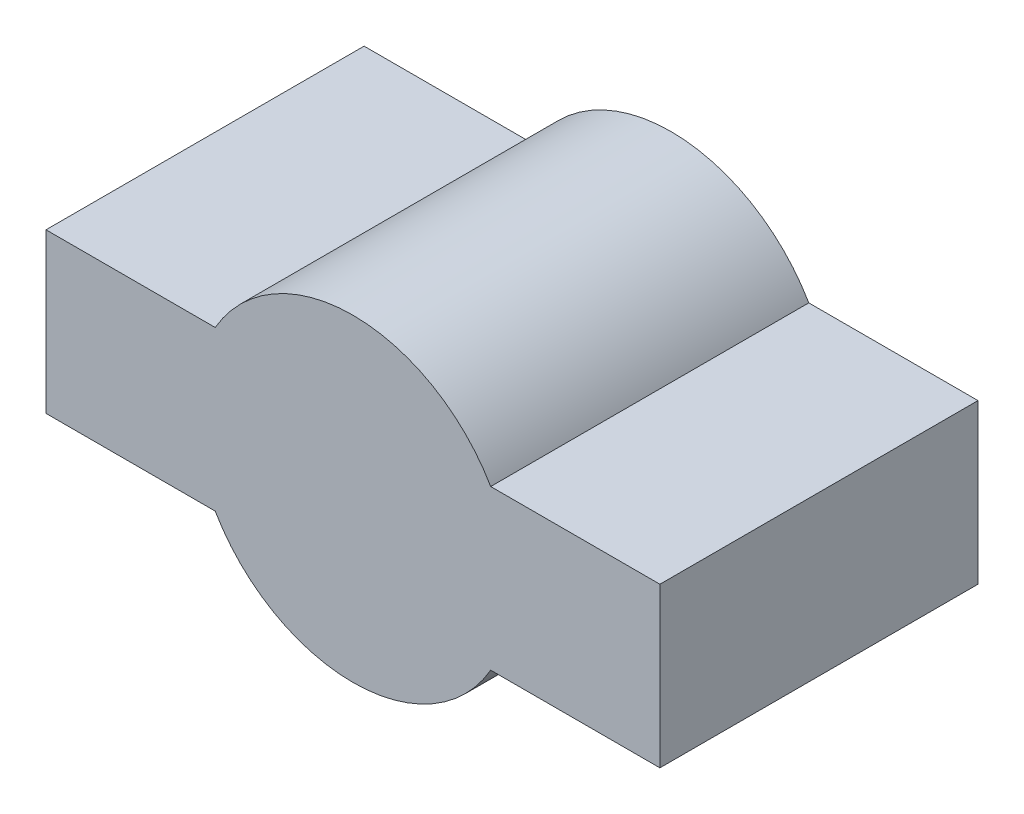
ISO-10303-21;
HEADER;
FILE_DESCRIPTION(('STEP AP214'),'2;1');
FILE_NAME('part.step','',(''),(''),'','','');
FILE_SCHEMA(('AUTOMOTIVE_DESIGN { 1 0 10303 214 1 1 1 1 }'));
ENDSEC;
DATA;
#1=APPLICATION_CONTEXT('core data for automotive mechanical design processes');
#2=APPLICATION_PROTOCOL_DEFINITION('international standard','automotive_design',2000,#1);
#3=PRODUCT_CONTEXT('',#1,'mechanical');
#4=PRODUCT('Part','Part','',(#3));
#5=PRODUCT_RELATED_PRODUCT_CATEGORY('part','',(#4));
#6=PRODUCT_DEFINITION_FORMATION('','',#4);
#7=PRODUCT_DEFINITION_CONTEXT('part definition',#1,'design');
#8=PRODUCT_DEFINITION('design','',#6,#7);
#9=PRODUCT_DEFINITION_SHAPE('','',#8);
#10=(LENGTH_UNIT() NAMED_UNIT(*) SI_UNIT(.MILLI.,.METRE.));
#11=(NAMED_UNIT(*) PLANE_ANGLE_UNIT() SI_UNIT($,.RADIAN.));
#12=(NAMED_UNIT(*) SI_UNIT($,.STERADIAN.) SOLID_ANGLE_UNIT());
#13=UNCERTAINTY_MEASURE_WITH_UNIT(LENGTH_MEASURE(1.E-05),#10,'distance_accuracy_value','');
#14=(GEOMETRIC_REPRESENTATION_CONTEXT(3) GLOBAL_UNCERTAINTY_ASSIGNED_CONTEXT((#13)) GLOBAL_UNIT_ASSIGNED_CONTEXT((#10,
#11,#12)) REPRESENTATION_CONTEXT('',''));
#15=CARTESIAN_POINT('',(0.,0.,0.));
#16=DIRECTION('',(0.,0.,1.));
#17=DIRECTION('',(1.,0.,0.));
#18=AXIS2_PLACEMENT_3D('',#15,#16,#17);
#19=CARTESIAN_POINT('',(0.866025403784439,-0.5,2.));
#20=DIRECTION('',(0.,1.,0.));
#21=DIRECTION('',(0.,0.,1.));
#22=AXIS2_PLACEMENT_3D('',#19,#20,#21);
#23=PLANE('',#22);
#24=DIRECTION('',(1.,0.,0.));
#25=VECTOR('',#24,1.);
#26=CARTESIAN_POINT('',(0.866025403784439,-0.5,0.));
#27=LINE('',#26,#25);
#28=CARTESIAN_POINT('',(0.866025403784438,-0.5,0.));
#29=VERTEX_POINT('',#28);
#30=CARTESIAN_POINT('',(1.93,-0.5,0.));
#31=VERTEX_POINT('',#30);
#32=EDGE_CURVE('E132',#29,#31,#27,.T.);
#33=ORIENTED_EDGE('',*,*,#32,.T.);
#34=DIRECTION('',(0.,0.,-1.));
#35=VECTOR('',#34,1.);
#36=CARTESIAN_POINT('',(1.93,-0.5,2.));
#37=LINE('',#36,#35);
#38=CARTESIAN_POINT('',(1.93,-0.5,2.));
#39=VERTEX_POINT('',#38);
#40=EDGE_CURVE('E11',#39,#31,#37,.T.);
#41=ORIENTED_EDGE('',*,*,#40,.F.);
#42=DIRECTION('',(1.,0.,0.));
#43=VECTOR('',#42,1.);
#44=CARTESIAN_POINT('',(0.866025403784439,-0.5,2.));
#45=LINE('',#44,#43);
#46=CARTESIAN_POINT('',(0.866025403784438,-0.5,2.));
#47=VERTEX_POINT('',#46);
#48=EDGE_CURVE('E147',#47,#39,#45,.T.);
#49=ORIENTED_EDGE('',*,*,#48,.F.);
#50=DIRECTION('',(0.,0.,-1.));
#51=VECTOR('',#50,1.);
#52=CARTESIAN_POINT('',(0.866025403784438,-0.5,2.));
#53=LINE('',#52,#51);
#54=EDGE_CURVE('E128',#47,#29,#53,.T.);
#55=ORIENTED_EDGE('',*,*,#54,.T.);
#56=EDGE_LOOP('',(#33,#41,#49,#55));
#57=FACE_BOUND('',#56,.T.);
#58=ADVANCED_FACE('F36',(#57),#23,.F.);
#59=CARTESIAN_POINT('',(1.93,0.5,2.));
#60=DIRECTION('',(-1.,0.,0.));
#61=DIRECTION('',(0.,0.,1.));
#62=AXIS2_PLACEMENT_3D('',#59,#60,#61);
#63=PLANE('',#62);
#64=DIRECTION('',(0.,1.,0.));
#65=VECTOR('',#64,1.);
#66=CARTESIAN_POINT('',(1.93,0.5,0.));
#67=LINE('',#66,#65);
#68=CARTESIAN_POINT('',(1.93,0.5,0.));
#69=VERTEX_POINT('',#68);
#70=EDGE_CURVE('E135',#31,#69,#67,.T.);
#71=ORIENTED_EDGE('',*,*,#70,.T.);
#72=DIRECTION('',(0.,0.,-1.));
#73=VECTOR('',#72,1.);
#74=CARTESIAN_POINT('',(1.93,0.5,2.));
#75=LINE('',#74,#73);
#76=CARTESIAN_POINT('',(1.93,0.5,2.));
#77=VERTEX_POINT('',#76);
#78=EDGE_CURVE('E44',#77,#69,#75,.T.);
#79=ORIENTED_EDGE('',*,*,#78,.F.);
#80=DIRECTION('',(0.,1.,0.));
#81=VECTOR('',#80,1.);
#82=CARTESIAN_POINT('',(1.93,0.5,2.));
#83=LINE('',#82,#81);
#84=EDGE_CURVE('E95',#39,#77,#83,.T.);
#85=ORIENTED_EDGE('',*,*,#84,.F.);
#86=ORIENTED_EDGE('',*,*,#40,.T.);
#87=EDGE_LOOP('',(#71,#79,#85,#86));
#88=FACE_BOUND('',#87,.T.);
#89=ADVANCED_FACE('F203',(#88),#63,.F.);
#90=CARTESIAN_POINT('',(0.866025403784439,0.5,2.));
#91=DIRECTION('',(0.,-1.,0.));
#92=DIRECTION('',(0.,0.,-1.));
#93=AXIS2_PLACEMENT_3D('',#90,#91,#92);
#94=PLANE('',#93);
#95=DIRECTION('',(-1.,0.,0.));
#96=VECTOR('',#95,1.);
#97=CARTESIAN_POINT('',(0.866025403784439,0.5,0.));
#98=LINE('',#97,#96);
#99=CARTESIAN_POINT('',(0.866025403784439,0.5,0.));
#100=VERTEX_POINT('',#99);
#101=EDGE_CURVE('E138',#69,#100,#98,.T.);
#102=ORIENTED_EDGE('',*,*,#101,.T.);
#103=DIRECTION('',(0.,0.,-1.));
#104=VECTOR('',#103,1.);
#105=CARTESIAN_POINT('',(0.866025403784439,0.5,2.));
#106=LINE('',#105,#104);
#107=CARTESIAN_POINT('',(0.866025403784439,0.5,2.));
#108=VERTEX_POINT('',#107);
#109=EDGE_CURVE('E154',#108,#100,#106,.T.);
#110=ORIENTED_EDGE('',*,*,#109,.F.);
#111=DIRECTION('',(-1.,0.,0.));
#112=VECTOR('',#111,1.);
#113=CARTESIAN_POINT('',(0.866025403784439,0.5,2.));
#114=LINE('',#113,#112);
#115=EDGE_CURVE('E162',#77,#108,#114,.T.);
#116=ORIENTED_EDGE('',*,*,#115,.F.);
#117=ORIENTED_EDGE('',*,*,#78,.T.);
#118=EDGE_LOOP('',(#102,#110,#116,#117));
#119=FACE_BOUND('',#118,.T.);
#120=ADVANCED_FACE('F160',(#119),#94,.F.);
#121=CARTESIAN_POINT('',(0.,0.,2.));
#122=DIRECTION('',(0.,0.,-1.));
#123=DIRECTION('',(-1.,0.,0.));
#124=AXIS2_PLACEMENT_3D('',#121,#122,#123);
#125=CYLINDRICAL_SURFACE('',#124,1.);
#126=CARTESIAN_POINT('',(0.,0.,0.));
#127=DIRECTION('',(0.,0.,1.));
#128=DIRECTION('',(1.,0.,0.));
#129=AXIS2_PLACEMENT_3D('',#126,#127,#128);
#130=CIRCLE('',#129,1.);
#131=CARTESIAN_POINT('',(-0.866025403784439,0.5,0.));
#132=VERTEX_POINT('',#131);
#133=EDGE_CURVE('E140',#100,#132,#130,.T.);
#134=ORIENTED_EDGE('',*,*,#133,.T.);
#135=DIRECTION('',(0.,0.,-1.));
#136=VECTOR('',#135,1.);
#137=CARTESIAN_POINT('',(-0.866025403784439,0.5,2.));
#138=LINE('',#137,#136);
#139=CARTESIAN_POINT('',(-0.866025403784439,0.5,2.));
#140=VERTEX_POINT('',#139);
#141=EDGE_CURVE('E151',#140,#132,#138,.T.);
#142=ORIENTED_EDGE('',*,*,#141,.F.);
#143=CARTESIAN_POINT('',(0.,0.,2.));
#144=DIRECTION('',(0.,0.,1.));
#145=DIRECTION('',(1.,0.,0.));
#146=AXIS2_PLACEMENT_3D('',#143,#144,#145);
#147=CIRCLE('',#146,1.);
#148=EDGE_CURVE('E174',#108,#140,#147,.T.);
#149=ORIENTED_EDGE('',*,*,#148,.F.);
#150=ORIENTED_EDGE('',*,*,#109,.T.);
#151=EDGE_LOOP('',(#134,#142,#149,#150));
#152=FACE_BOUND('',#151,.T.);
#153=ADVANCED_FACE('F170',(#152),#125,.T.);
#154=CARTESIAN_POINT('',(-1.93,0.5,2.));
#155=DIRECTION('',(0.,-1.,0.));
#156=DIRECTION('',(0.,0.,-1.));
#157=AXIS2_PLACEMENT_3D('',#154,#155,#156);
#158=PLANE('',#157);
#159=DIRECTION('',(-1.,0.,0.));
#160=VECTOR('',#159,1.);
#161=CARTESIAN_POINT('',(-1.93,0.5,0.));
#162=LINE('',#161,#160);
#163=CARTESIAN_POINT('',(-1.93,0.5,0.));
#164=VERTEX_POINT('',#163);
#165=EDGE_CURVE('E142',#132,#164,#162,.T.);
#166=ORIENTED_EDGE('',*,*,#165,.T.);
#167=DIRECTION('',(0.,0.,-1.));
#168=VECTOR('',#167,1.);
#169=CARTESIAN_POINT('',(-1.93,0.5,2.));
#170=LINE('',#169,#168);
#171=CARTESIAN_POINT('',(-1.93,0.5,2.));
#172=VERTEX_POINT('',#171);
#173=EDGE_CURVE('E123',#172,#164,#170,.T.);
#174=ORIENTED_EDGE('',*,*,#173,.F.);
#175=DIRECTION('',(-1.,0.,0.));
#176=VECTOR('',#175,1.);
#177=CARTESIAN_POINT('',(-1.93,0.5,2.));
#178=LINE('',#177,#176);
#179=EDGE_CURVE('E114',#140,#172,#178,.T.);
#180=ORIENTED_EDGE('',*,*,#179,.F.);
#181=ORIENTED_EDGE('',*,*,#141,.T.);
#182=EDGE_LOOP('',(#166,#174,#180,#181));
#183=FACE_BOUND('',#182,.T.);
#184=ADVANCED_FACE('F173',(#183),#158,.F.);
#185=CARTESIAN_POINT('',(-1.93,0.5,2.));
#186=DIRECTION('',(1.,0.,0.));
#187=DIRECTION('',(0.,1.,0.));
#188=AXIS2_PLACEMENT_3D('',#185,#186,#187);
#189=PLANE('',#188);
#190=DIRECTION('',(0.,-1.,0.));
#191=VECTOR('',#190,1.);
#192=CARTESIAN_POINT('',(-1.93,0.5,0.));
#193=LINE('',#192,#191);
#194=CARTESIAN_POINT('',(-1.93,-0.5,0.));
#195=VERTEX_POINT('',#194);
#196=EDGE_CURVE('E122',#164,#195,#193,.T.);
#197=ORIENTED_EDGE('',*,*,#196,.T.);
#198=DIRECTION('',(0.,0.,-1.));
#199=VECTOR('',#198,1.);
#200=CARTESIAN_POINT('',(-1.93,-0.5,2.));
#201=LINE('',#200,#199);
#202=CARTESIAN_POINT('',(-1.93,-0.5,2.));
#203=VERTEX_POINT('',#202);
#204=EDGE_CURVE('E119',#203,#195,#201,.T.);
#205=ORIENTED_EDGE('',*,*,#204,.F.);
#206=DIRECTION('',(0.,-1.,0.));
#207=VECTOR('',#206,1.);
#208=CARTESIAN_POINT('',(-1.93,0.5,2.));
#209=LINE('',#208,#207);
#210=EDGE_CURVE('E108',#172,#203,#209,.T.);
#211=ORIENTED_EDGE('',*,*,#210,.F.);
#212=ORIENTED_EDGE('',*,*,#173,.T.);
#213=EDGE_LOOP('',(#197,#205,#211,#212));
#214=FACE_BOUND('',#213,.T.);
#215=ADVANCED_FACE('F120',(#214),#189,.F.);
#216=CARTESIAN_POINT('',(-1.93,-0.5,2.));
#217=DIRECTION('',(0.,1.,0.));
#218=DIRECTION('',(0.,0.,1.));
#219=AXIS2_PLACEMENT_3D('',#216,#217,#218);
#220=PLANE('',#219);
#221=DIRECTION('',(1.,0.,0.));
#222=VECTOR('',#221,1.);
#223=CARTESIAN_POINT('',(-1.93,-0.5,0.));
#224=LINE('',#223,#222);
#225=CARTESIAN_POINT('',(-0.866025403784439,-0.5,0.));
#226=VERTEX_POINT('',#225);
#227=EDGE_CURVE('E81',#195,#226,#224,.T.);
#228=ORIENTED_EDGE('',*,*,#227,.T.);
#229=DIRECTION('',(0.,0.,-1.));
#230=VECTOR('',#229,1.);
#231=CARTESIAN_POINT('',(-0.866025403784439,-0.5,2.));
#232=LINE('',#231,#230);
#233=CARTESIAN_POINT('',(-0.866025403784439,-0.5,2.));
#234=VERTEX_POINT('',#233);
#235=EDGE_CURVE('E124',#234,#226,#232,.T.);
#236=ORIENTED_EDGE('',*,*,#235,.F.);
#237=DIRECTION('',(1.,0.,0.));
#238=VECTOR('',#237,1.);
#239=CARTESIAN_POINT('',(-1.93,-0.5,2.));
#240=LINE('',#239,#238);
#241=EDGE_CURVE('E112',#203,#234,#240,.T.);
#242=ORIENTED_EDGE('',*,*,#241,.F.);
#243=ORIENTED_EDGE('',*,*,#204,.T.);
#244=EDGE_LOOP('',(#228,#236,#242,#243));
#245=FACE_BOUND('',#244,.T.);
#246=ADVANCED_FACE('F126',(#245),#220,.F.);
#247=CARTESIAN_POINT('',(0.,0.,2.));
#248=DIRECTION('',(0.,0.,-1.));
#249=DIRECTION('',(-1.,0.,0.));
#250=AXIS2_PLACEMENT_3D('',#247,#248,#249);
#251=CYLINDRICAL_SURFACE('',#250,1.);
#252=CARTESIAN_POINT('',(0.,0.,0.));
#253=DIRECTION('',(0.,0.,1.));
#254=DIRECTION('',(1.,0.,0.));
#255=AXIS2_PLACEMENT_3D('',#252,#253,#254);
#256=CIRCLE('',#255,1.);
#257=EDGE_CURVE('E87',#226,#29,#256,.T.);
#258=ORIENTED_EDGE('',*,*,#257,.T.);
#259=ORIENTED_EDGE('',*,*,#54,.F.);
#260=CARTESIAN_POINT('',(0.,0.,2.));
#261=DIRECTION('',(0.,0.,1.));
#262=DIRECTION('',(1.,0.,0.));
#263=AXIS2_PLACEMENT_3D('',#260,#261,#262);
#264=CIRCLE('',#263,1.);
#265=EDGE_CURVE('E52',#234,#47,#264,.T.);
#266=ORIENTED_EDGE('',*,*,#265,.F.);
#267=ORIENTED_EDGE('',*,*,#235,.T.);
#268=EDGE_LOOP('',(#258,#259,#266,#267));
#269=FACE_BOUND('',#268,.T.);
#270=ADVANCED_FACE('F199',(#269),#251,.T.);
#271=CARTESIAN_POINT('',(0.,0.,2.));
#272=DIRECTION('',(0.,0.,1.));
#273=DIRECTION('',(1.,0.,0.));
#274=AXIS2_PLACEMENT_3D('',#271,#272,#273);
#275=PLANE('',#274);
#276=ORIENTED_EDGE('',*,*,#48,.T.);
#277=ORIENTED_EDGE('',*,*,#84,.T.);
#278=ORIENTED_EDGE('',*,*,#115,.T.);
#279=ORIENTED_EDGE('',*,*,#148,.T.);
#280=ORIENTED_EDGE('',*,*,#179,.T.);
#281=ORIENTED_EDGE('',*,*,#210,.T.);
#282=ORIENTED_EDGE('',*,*,#241,.T.);
#283=ORIENTED_EDGE('',*,*,#265,.T.);
#284=EDGE_LOOP('',(#276,#277,#278,#279,#280,#281,#282,#283));
#285=FACE_BOUND('',#284,.T.);
#286=ADVANCED_FACE('F110',(#285),#275,.T.);
#287=CARTESIAN_POINT('',(0.,0.,0.));
#288=DIRECTION('',(0.,0.,1.));
#289=DIRECTION('',(1.,0.,0.));
#290=AXIS2_PLACEMENT_3D('',#287,#288,#289);
#291=PLANE('',#290);
#292=CARTESIAN_POINT('',(0.,0.,0.));
#293=DIRECTION('',(0.,0.,-1.));
#294=DIRECTION('',(-1.,0.,0.));
#295=AXIS2_PLACEMENT_3D('',#292,#293,#294);
#296=CIRCLE('',#295,0.95);
#297=CARTESIAN_POINT('',(-0.95,0.,0.));
#298=VERTEX_POINT('',#297);
#299=EDGE_CURVE('E180',#298,#298,#296,.T.);
#300=ORIENTED_EDGE('',*,*,#299,.F.);
#301=EDGE_LOOP('',(#300));
#302=FACE_BOUND('',#301,.T.);
#303=ORIENTED_EDGE('',*,*,#32,.F.);
#304=ORIENTED_EDGE('',*,*,#257,.F.);
#305=ORIENTED_EDGE('',*,*,#227,.F.);
#306=ORIENTED_EDGE('',*,*,#196,.F.);
#307=ORIENTED_EDGE('',*,*,#165,.F.);
#308=ORIENTED_EDGE('',*,*,#133,.F.);
#309=ORIENTED_EDGE('',*,*,#101,.F.);
#310=ORIENTED_EDGE('',*,*,#70,.F.);
#311=EDGE_LOOP('',(#303,#304,#305,#306,#307,#308,#309,#310));
#312=FACE_BOUND('',#311,.T.);
#313=ADVANCED_FACE('F166',(#302,#312),#291,.F.);
#314=CARTESIAN_POINT('',(0.,0.,1.8));
#315=DIRECTION('',(0.,0.,-1.));
#316=DIRECTION('',(-1.,0.,0.));
#317=AXIS2_PLACEMENT_3D('',#314,#315,#316);
#318=CYLINDRICAL_SURFACE('',#317,0.95);
#319=CARTESIAN_POINT('',(0.,0.,1.8));
#320=DIRECTION('',(0.,0.,-1.));
#321=DIRECTION('',(-1.,0.,0.));
#322=AXIS2_PLACEMENT_3D('',#319,#320,#321);
#323=CIRCLE('',#322,0.95);
#324=CARTESIAN_POINT('',(-0.95,0.,1.8));
#325=VERTEX_POINT('',#324);
#326=EDGE_CURVE('E136',#325,#325,#323,.T.);
#327=ORIENTED_EDGE('',*,*,#326,.F.);
#328=EDGE_LOOP('',(#327));
#329=FACE_BOUND('',#328,.T.);
#330=ORIENTED_EDGE('',*,*,#299,.T.);
#331=EDGE_LOOP('',(#330));
#332=FACE_BOUND('',#331,.T.);
#333=ADVANCED_FACE('F188',(#329,#332),#318,.F.);
#334=CARTESIAN_POINT('',(0.,0.,1.8));
#335=DIRECTION('',(0.,0.,-1.));
#336=DIRECTION('',(-1.,0.,0.));
#337=AXIS2_PLACEMENT_3D('',#334,#335,#336);
#338=PLANE('',#337);
#339=ORIENTED_EDGE('',*,*,#326,.T.);
#340=EDGE_LOOP('',(#339));
#341=FACE_BOUND('',#340,.T.);
#342=ADVANCED_FACE('F186',(#341),#338,.T.);
#343=CLOSED_SHELL('',(#58,#89,#120,#153,#184,#215,#246,#270,#286,#313,#333,#342));
#344=MANIFOLD_SOLID_BREP('B2',#343);
#345=ADVANCED_BREP_SHAPE_REPRESENTATION('',(#18,#344),#14);
#346=SHAPE_DEFINITION_REPRESENTATION(#9,#345);
ENDSEC;
END-ISO-10303-21;
